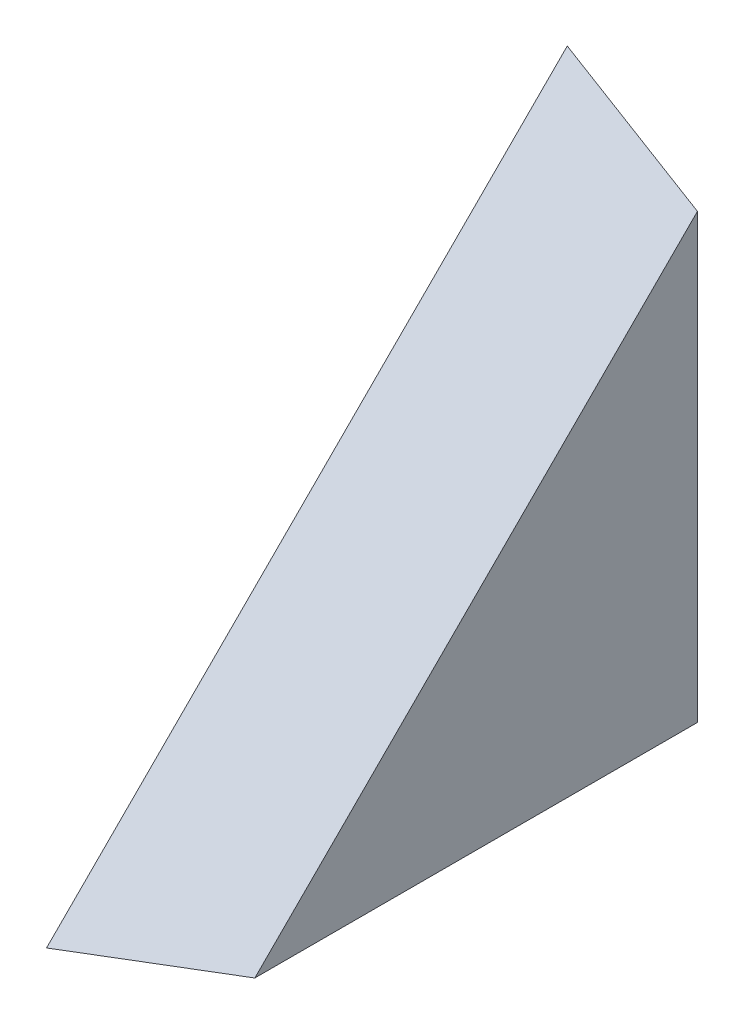
ISO-10303-21;
HEADER;
FILE_DESCRIPTION(('STEP AP214'),'2;1');
FILE_NAME('part.step','',(''),(''),'','','');
FILE_SCHEMA(('AUTOMOTIVE_DESIGN { 1 0 10303 214 1 1 1 1 }'));
ENDSEC;
DATA;
#1=APPLICATION_CONTEXT('core data for automotive mechanical design processes');
#2=APPLICATION_PROTOCOL_DEFINITION('international standard','automotive_design',2000,#1);
#3=PRODUCT_CONTEXT('',#1,'mechanical');
#4=PRODUCT('Part','Part','',(#3));
#5=PRODUCT_RELATED_PRODUCT_CATEGORY('part','',(#4));
#6=PRODUCT_DEFINITION_FORMATION('','',#4);
#7=PRODUCT_DEFINITION_CONTEXT('part definition',#1,'design');
#8=PRODUCT_DEFINITION('design','',#6,#7);
#9=PRODUCT_DEFINITION_SHAPE('','',#8);
#10=(LENGTH_UNIT() NAMED_UNIT(*) SI_UNIT(.MILLI.,.METRE.));
#11=(NAMED_UNIT(*) PLANE_ANGLE_UNIT() SI_UNIT($,.RADIAN.));
#12=(NAMED_UNIT(*) SI_UNIT($,.STERADIAN.) SOLID_ANGLE_UNIT());
#13=UNCERTAINTY_MEASURE_WITH_UNIT(LENGTH_MEASURE(1.E-05),#10,'distance_accuracy_value','');
#14=(GEOMETRIC_REPRESENTATION_CONTEXT(3) GLOBAL_UNCERTAINTY_ASSIGNED_CONTEXT((#13)) GLOBAL_UNIT_ASSIGNED_CONTEXT((#10,
#11,#12)) REPRESENTATION_CONTEXT('',''));
#15=CARTESIAN_POINT('',(0.,0.,0.));
#16=DIRECTION('',(0.,0.,1.));
#17=DIRECTION('',(1.,0.,0.));
#18=AXIS2_PLACEMENT_3D('',#15,#16,#17);
#19=CARTESIAN_POINT('',(12.7,0.,-25.4));
#20=DIRECTION('',(0.,0.,1.));
#21=DIRECTION('',(1.,0.,0.));
#22=AXIS2_PLACEMENT_3D('',#19,#20,#21);
#23=PLANE('',#22);
#24=DIRECTION('',(0.,1.,0.));
#25=VECTOR('',#24,1.);
#26=CARTESIAN_POINT('',(0.,0.,-25.4));
#27=LINE('',#26,#25);
#28=CARTESIAN_POINT('',(0.,0.,-25.4));
#29=VERTEX_POINT('',#28);
#30=CARTESIAN_POINT('',(0.,50.8,-25.4));
#31=VERTEX_POINT('',#30);
#32=EDGE_CURVE('E74',#29,#31,#27,.T.);
#33=ORIENTED_EDGE('',*,*,#32,.T.);
#34=DIRECTION('',(0.857492925712544,-0.514495755427527,0.));
#35=VECTOR('',#34,1.);
#36=CARTESIAN_POINT('',(31.75,31.75,-25.4));
#37=LINE('',#36,#35);
#38=CARTESIAN_POINT('',(12.7,43.18,-25.4));
#39=VERTEX_POINT('',#38);
#40=EDGE_CURVE('E58',#31,#39,#37,.T.);
#41=ORIENTED_EDGE('',*,*,#40,.T.);
#42=DIRECTION('',(0.,1.,0.));
#43=VECTOR('',#42,1.);
#44=CARTESIAN_POINT('',(12.7,0.,-25.4));
#45=LINE('',#44,#43);
#46=CARTESIAN_POINT('',(12.7,0.,-25.4));
#47=VERTEX_POINT('',#46);
#48=EDGE_CURVE('E80',#47,#39,#45,.T.);
#49=ORIENTED_EDGE('',*,*,#48,.F.);
#50=DIRECTION('',(-1.,0.,0.));
#51=VECTOR('',#50,1.);
#52=CARTESIAN_POINT('',(12.7,0.,-25.4));
#53=LINE('',#52,#51);
#54=EDGE_CURVE('E11',#47,#29,#53,.T.);
#55=ORIENTED_EDGE('',*,*,#54,.T.);
#56=EDGE_LOOP('',(#33,#41,#49,#55));
#57=FACE_BOUND('',#56,.T.);
#58=ADVANCED_FACE('F32',(#57),#23,.F.);
#59=CARTESIAN_POINT('',(12.7,0.,25.4));
#60=DIRECTION('',(0.,1.,0.));
#61=DIRECTION('',(0.,0.,1.));
#62=AXIS2_PLACEMENT_3D('',#59,#60,#61);
#63=PLANE('',#62);
#64=DIRECTION('',(0.,0.,-1.));
#65=VECTOR('',#64,1.);
#66=CARTESIAN_POINT('',(12.7,0.,25.4));
#67=LINE('',#66,#65);
#68=CARTESIAN_POINT('',(12.7,0.,17.78));
#69=VERTEX_POINT('',#68);
#70=EDGE_CURVE('E40',#69,#47,#67,.T.);
#71=ORIENTED_EDGE('',*,*,#70,.F.);
#72=DIRECTION('',(-0.857492925712544,0.,0.514495755427527));
#73=VECTOR('',#72,1.);
#74=CARTESIAN_POINT('',(9.33823529411765,0.,19.7970588235294));
#75=LINE('',#74,#73);
#76=CARTESIAN_POINT('',(0.,0.,25.4));
#77=VERTEX_POINT('',#76);
#78=EDGE_CURVE('E63',#69,#77,#75,.T.);
#79=ORIENTED_EDGE('',*,*,#78,.T.);
#80=DIRECTION('',(0.,0.,-1.));
#81=VECTOR('',#80,1.);
#82=CARTESIAN_POINT('',(0.,0.,25.4));
#83=LINE('',#82,#81);
#84=EDGE_CURVE('E73',#77,#29,#83,.T.);
#85=ORIENTED_EDGE('',*,*,#84,.T.);
#86=ORIENTED_EDGE('',*,*,#54,.F.);
#87=EDGE_LOOP('',(#71,#79,#85,#86));
#88=FACE_BOUND('',#87,.T.);
#89=ADVANCED_FACE('F77',(#88),#63,.F.);
#90=CARTESIAN_POINT('',(12.7,0.,0.));
#91=DIRECTION('',(-1.,0.,0.));
#92=DIRECTION('',(0.,0.,1.));
#93=AXIS2_PLACEMENT_3D('',#90,#91,#92);
#94=PLANE('',#93);
#95=ORIENTED_EDGE('',*,*,#48,.T.);
#96=DIRECTION('',(0.,-0.707106781186548,0.707106781186547));
#97=VECTOR('',#96,1.);
#98=CARTESIAN_POINT('',(12.7,50.8,-33.02));
#99=LINE('',#98,#97);
#100=EDGE_CURVE('E65',#39,#69,#99,.T.);
#101=ORIENTED_EDGE('',*,*,#100,.T.);
#102=ORIENTED_EDGE('',*,*,#70,.T.);
#103=EDGE_LOOP('',(#95,#101,#102));
#104=FACE_BOUND('',#103,.T.);
#105=ADVANCED_FACE('F86',(#104),#94,.F.);
#106=CARTESIAN_POINT('',(0.,0.,0.));
#107=DIRECTION('',(-1.,0.,0.));
#108=DIRECTION('',(0.,0.,1.));
#109=AXIS2_PLACEMENT_3D('',#106,#107,#108);
#110=PLANE('',#109);
#111=ORIENTED_EDGE('',*,*,#32,.F.);
#112=ORIENTED_EDGE('',*,*,#84,.F.);
#113=DIRECTION('',(0.,-0.707106781186548,0.707106781186547));
#114=VECTOR('',#113,1.);
#115=CARTESIAN_POINT('',(0.,50.8,-25.4));
#116=LINE('',#115,#114);
#117=EDGE_CURVE('E67',#31,#77,#116,.T.);
#118=ORIENTED_EDGE('',*,*,#117,.F.);
#119=EDGE_LOOP('',(#111,#112,#118));
#120=FACE_BOUND('',#119,.T.);
#121=ADVANCED_FACE('F79',(#120),#110,.T.);
#122=CARTESIAN_POINT('',(12.7,50.8,-33.02));
#123=DIRECTION('',(-0.390566732942472,-0.650944554904119,-0.650944554904119));
#124=DIRECTION('',(0.,0.707106781186548,-0.707106781186547));
#125=AXIS2_PLACEMENT_3D('',#122,#123,#124);
#126=PLANE('',#125);
#127=ORIENTED_EDGE('',*,*,#117,.T.);
#128=ORIENTED_EDGE('',*,*,#78,.F.);
#129=ORIENTED_EDGE('',*,*,#100,.F.);
#130=ORIENTED_EDGE('',*,*,#40,.F.);
#131=EDGE_LOOP('',(#127,#128,#129,#130));
#132=FACE_BOUND('',#131,.T.);
#133=ADVANCED_FACE('F68',(#132),#126,.F.);
#134=CLOSED_SHELL('',(#58,#89,#105,#121,#133));
#135=MANIFOLD_SOLID_BREP('B2',#134);
#136=ADVANCED_BREP_SHAPE_REPRESENTATION('',(#18,#135),#14);
#137=SHAPE_DEFINITION_REPRESENTATION(#9,#136);
ENDSEC;
END-ISO-10303-21;
